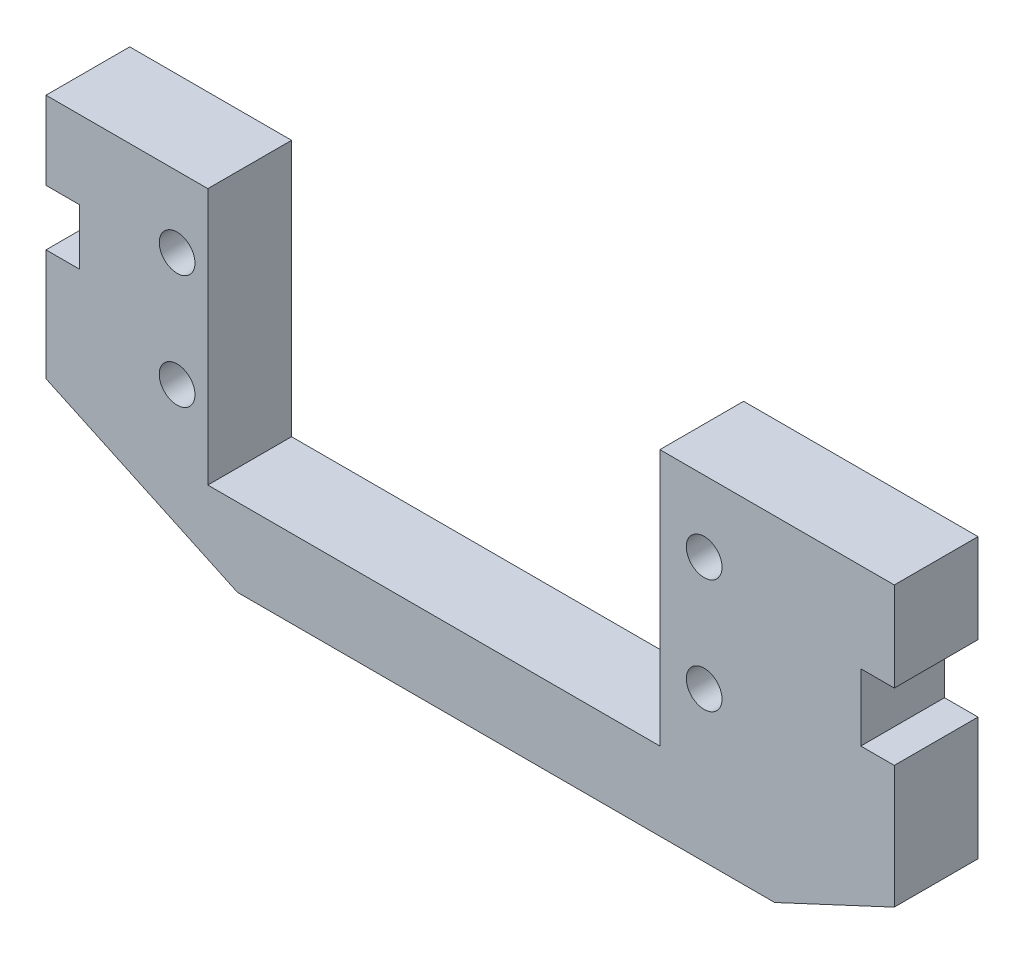
ISO-10303-21;
HEADER;
FILE_DESCRIPTION(('STEP AP214'),'2;1');
FILE_NAME('part.step','',(''),(''),'','','');
FILE_SCHEMA(('AUTOMOTIVE_DESIGN { 1 0 10303 214 1 1 1 1 }'));
ENDSEC;
DATA;
#1=APPLICATION_CONTEXT('core data for automotive mechanical design processes');
#2=APPLICATION_PROTOCOL_DEFINITION('international standard','automotive_design',2000,#1);
#3=PRODUCT_CONTEXT('',#1,'mechanical');
#4=PRODUCT('Part','Part','',(#3));
#5=PRODUCT_RELATED_PRODUCT_CATEGORY('part','',(#4));
#6=PRODUCT_DEFINITION_FORMATION('','',#4);
#7=PRODUCT_DEFINITION_CONTEXT('part definition',#1,'design');
#8=PRODUCT_DEFINITION('design','',#6,#7);
#9=PRODUCT_DEFINITION_SHAPE('','',#8);
#10=(LENGTH_UNIT() NAMED_UNIT(*) SI_UNIT(.MILLI.,.METRE.));
#11=(NAMED_UNIT(*) PLANE_ANGLE_UNIT() SI_UNIT($,.RADIAN.));
#12=(NAMED_UNIT(*) SI_UNIT($,.STERADIAN.) SOLID_ANGLE_UNIT());
#13=UNCERTAINTY_MEASURE_WITH_UNIT(LENGTH_MEASURE(1.E-05),#10,'distance_accuracy_value','');
#14=(GEOMETRIC_REPRESENTATION_CONTEXT(3) GLOBAL_UNCERTAINTY_ASSIGNED_CONTEXT((#13)) GLOBAL_UNIT_ASSIGNED_CONTEXT((#10,
#11,#12)) REPRESENTATION_CONTEXT('',''));
#15=CARTESIAN_POINT('',(0.,0.,0.));
#16=DIRECTION('',(0.,0.,1.));
#17=DIRECTION('',(1.,0.,0.));
#18=AXIS2_PLACEMENT_3D('',#15,#16,#17);
#19=CARTESIAN_POINT('',(0.,0.,7.5));
#20=DIRECTION('',(1.,0.,0.));
#21=DIRECTION('',(0.,1.,0.));
#22=AXIS2_PLACEMENT_3D('',#19,#20,#21);
#23=PLANE('',#22);
#24=DIRECTION('',(0.,-1.,0.));
#25=VECTOR('',#24,1.);
#26=CARTESIAN_POINT('',(0.,0.,0.));
#27=LINE('',#26,#25);
#28=CARTESIAN_POINT('',(0.,0.,0.));
#29=VERTEX_POINT('',#28);
#30=CARTESIAN_POINT('',(0.,-7.,0.));
#31=VERTEX_POINT('',#30);
#32=EDGE_CURVE('E180',#29,#31,#27,.T.);
#33=ORIENTED_EDGE('',*,*,#32,.T.);
#34=DIRECTION('',(0.,0.,1.));
#35=VECTOR('',#34,1.);
#36=CARTESIAN_POINT('',(0.,-7.,0.));
#37=LINE('',#36,#35);
#38=CARTESIAN_POINT('',(0.,-7.,7.5));
#39=VERTEX_POINT('',#38);
#40=EDGE_CURVE('E278',#31,#39,#37,.T.);
#41=ORIENTED_EDGE('',*,*,#40,.T.);
#42=DIRECTION('',(0.,-1.,0.));
#43=VECTOR('',#42,1.);
#44=CARTESIAN_POINT('',(0.,0.,7.5));
#45=LINE('',#44,#43);
#46=CARTESIAN_POINT('',(0.,0.,7.5));
#47=VERTEX_POINT('',#46);
#48=EDGE_CURVE('E253',#47,#39,#45,.T.);
#49=ORIENTED_EDGE('',*,*,#48,.F.);
#50=DIRECTION('',(0.,0.,-1.));
#51=VECTOR('',#50,1.);
#52=CARTESIAN_POINT('',(0.,0.,7.5));
#53=LINE('',#52,#51);
#54=EDGE_CURVE('E221',#47,#29,#53,.T.);
#55=ORIENTED_EDGE('',*,*,#54,.T.);
#56=EDGE_LOOP('',(#33,#41,#49,#55));
#57=FACE_BOUND('',#56,.T.);
#58=ADVANCED_FACE('F33',(#57),#23,.F.);
#59=CARTESIAN_POINT('',(76.,-30.,7.5));
#60=DIRECTION('',(-1.,0.,0.));
#61=DIRECTION('',(0.,0.,1.));
#62=AXIS2_PLACEMENT_3D('',#59,#60,#61);
#63=PLANE('',#62);
#64=DIRECTION('',(0.,1.,0.));
#65=VECTOR('',#64,1.);
#66=CARTESIAN_POINT('',(76.,-30.,0.));
#67=LINE('',#66,#65);
#68=CARTESIAN_POINT('',(76.,-25.,0.));
#69=VERTEX_POINT('',#68);
#70=CARTESIAN_POINT('',(76.,-14.,0.));
#71=VERTEX_POINT('',#70);
#72=EDGE_CURVE('E193',#69,#71,#67,.T.);
#73=ORIENTED_EDGE('',*,*,#72,.T.);
#74=DIRECTION('',(0.,0.,1.));
#75=VECTOR('',#74,1.);
#76=CARTESIAN_POINT('',(76.,-14.,0.));
#77=LINE('',#76,#75);
#78=CARTESIAN_POINT('',(76.,-14.,7.5));
#79=VERTEX_POINT('',#78);
#80=EDGE_CURVE('E283',#71,#79,#77,.T.);
#81=ORIENTED_EDGE('',*,*,#80,.T.);
#82=DIRECTION('',(0.,1.,0.));
#83=VECTOR('',#82,1.);
#84=CARTESIAN_POINT('',(76.,-30.,7.5));
#85=LINE('',#84,#83);
#86=CARTESIAN_POINT('',(76.,-25.,7.5));
#87=VERTEX_POINT('',#86);
#88=EDGE_CURVE('E260',#87,#79,#85,.T.);
#89=ORIENTED_EDGE('',*,*,#88,.F.);
#90=DIRECTION('',(0.,0.,-1.));
#91=VECTOR('',#90,1.);
#92=CARTESIAN_POINT('',(76.,-25.,7.5));
#93=LINE('',#92,#91);
#94=EDGE_CURVE('E232',#87,#69,#93,.T.);
#95=ORIENTED_EDGE('',*,*,#94,.T.);
#96=EDGE_LOOP('',(#73,#81,#89,#95));
#97=FACE_BOUND('',#96,.T.);
#98=ADVANCED_FACE('F258',(#97),#63,.F.);
#99=CARTESIAN_POINT('',(14.5,0.,7.5));
#100=DIRECTION('',(0.,-1.,0.));
#101=DIRECTION('',(1.,0.,0.));
#102=AXIS2_PLACEMENT_3D('',#99,#100,#101);
#103=PLANE('',#102);
#104=DIRECTION('',(-1.,0.,0.));
#105=VECTOR('',#104,1.);
#106=CARTESIAN_POINT('',(14.5,0.,0.));
#107=LINE('',#106,#105);
#108=CARTESIAN_POINT('',(14.5,0.,0.));
#109=VERTEX_POINT('',#108);
#110=EDGE_CURVE('E181',#109,#29,#107,.T.);
#111=ORIENTED_EDGE('',*,*,#110,.T.);
#112=ORIENTED_EDGE('',*,*,#54,.F.);
#113=DIRECTION('',(-1.,0.,0.));
#114=VECTOR('',#113,1.);
#115=CARTESIAN_POINT('',(14.5,0.,7.5));
#116=LINE('',#115,#114);
#117=CARTESIAN_POINT('',(14.5,0.,7.5));
#118=VERTEX_POINT('',#117);
#119=EDGE_CURVE('E204',#118,#47,#116,.T.);
#120=ORIENTED_EDGE('',*,*,#119,.F.);
#121=DIRECTION('',(0.,0.,-1.));
#122=VECTOR('',#121,1.);
#123=CARTESIAN_POINT('',(14.5,0.,7.5));
#124=LINE('',#123,#122);
#125=EDGE_CURVE('E205',#118,#109,#124,.T.);
#126=ORIENTED_EDGE('',*,*,#125,.T.);
#127=EDGE_LOOP('',(#111,#112,#120,#126));
#128=FACE_BOUND('',#127,.T.);
#129=ADVANCED_FACE('F332',(#128),#103,.F.);
#130=CARTESIAN_POINT('',(0.,-12.,7.5));
#131=VERTEX_POINT('',#130);
#132=CARTESIAN_POINT('',(0.,-22.,7.5));
#133=VERTEX_POINT('',#132);
#134=EDGE_CURVE('E173',#131,#133,#45,.T.);
#135=ORIENTED_EDGE('',*,*,#134,.F.);
#136=DIRECTION('',(0.,0.,1.));
#137=VECTOR('',#136,1.);
#138=CARTESIAN_POINT('',(0.,-12.,0.));
#139=LINE('',#138,#137);
#140=CARTESIAN_POINT('',(0.,-12.,0.));
#141=VERTEX_POINT('',#140);
#142=EDGE_CURVE('E160',#141,#131,#139,.T.);
#143=ORIENTED_EDGE('',*,*,#142,.F.);
#144=CARTESIAN_POINT('',(0.,-22.,0.));
#145=VERTEX_POINT('',#144);
#146=EDGE_CURVE('E171',#141,#145,#27,.T.);
#147=ORIENTED_EDGE('',*,*,#146,.T.);
#148=DIRECTION('',(0.,0.,1.));
#149=VECTOR('',#148,1.);
#150=CARTESIAN_POINT('',(0.,-22.,7.5));
#151=LINE('',#150,#149);
#152=EDGE_CURVE('E228',#145,#133,#151,.T.);
#153=ORIENTED_EDGE('',*,*,#152,.T.);
#154=EDGE_LOOP('',(#135,#143,#147,#153));
#155=FACE_BOUND('',#154,.T.);
#156=ADVANCED_FACE('F169',(#155),#23,.F.);
#157=CARTESIAN_POINT('',(0.,-30.,7.5));
#158=DIRECTION('',(0.,1.,0.));
#159=DIRECTION('',(0.,0.,1.));
#160=AXIS2_PLACEMENT_3D('',#157,#158,#159);
#161=PLANE('',#160);
#162=DIRECTION('',(1.,0.,0.));
#163=VECTOR('',#162,1.);
#164=CARTESIAN_POINT('',(0.,-30.,0.));
#165=LINE('',#164,#163);
#166=CARTESIAN_POINT('',(17.1560553640765,-30.,0.));
#167=VERTEX_POINT('',#166);
#168=CARTESIAN_POINT('',(65.2774653974522,-30.,0.));
#169=VERTEX_POINT('',#168);
#170=EDGE_CURVE('E184',#167,#169,#165,.T.);
#171=ORIENTED_EDGE('',*,*,#170,.T.);
#172=DIRECTION('',(0.,0.,1.));
#173=VECTOR('',#172,1.);
#174=CARTESIAN_POINT('',(65.2774653974522,-30.,7.5));
#175=LINE('',#174,#173);
#176=CARTESIAN_POINT('',(65.2774653974522,-30.,7.5));
#177=VERTEX_POINT('',#176);
#178=EDGE_CURVE('E41',#169,#177,#175,.T.);
#179=ORIENTED_EDGE('',*,*,#178,.T.);
#180=DIRECTION('',(1.,0.,0.));
#181=VECTOR('',#180,1.);
#182=CARTESIAN_POINT('',(0.,-30.,7.5));
#183=LINE('',#182,#181);
#184=CARTESIAN_POINT('',(17.1560553640765,-30.,7.5));
#185=VERTEX_POINT('',#184);
#186=EDGE_CURVE('E241',#185,#177,#183,.T.);
#187=ORIENTED_EDGE('',*,*,#186,.F.);
#188=DIRECTION('',(0.,0.,-1.));
#189=VECTOR('',#188,1.);
#190=CARTESIAN_POINT('',(17.1560553640765,-30.,7.5));
#191=LINE('',#190,#189);
#192=EDGE_CURVE('E224',#185,#167,#191,.T.);
#193=ORIENTED_EDGE('',*,*,#192,.T.);
#194=EDGE_LOOP('',(#171,#179,#187,#193));
#195=FACE_BOUND('',#194,.T.);
#196=ADVANCED_FACE('F240',(#195),#161,.F.);
#197=CARTESIAN_POINT('',(76.,-8.,7.5));
#198=VERTEX_POINT('',#197);
#199=CARTESIAN_POINT('',(76.,0.,7.5));
#200=VERTEX_POINT('',#199);
#201=EDGE_CURVE('E252',#198,#200,#85,.T.);
#202=ORIENTED_EDGE('',*,*,#201,.F.);
#203=DIRECTION('',(0.,0.,1.));
#204=VECTOR('',#203,1.);
#205=CARTESIAN_POINT('',(76.,-8.,0.));
#206=LINE('',#205,#204);
#207=CARTESIAN_POINT('',(76.,-8.,0.));
#208=VERTEX_POINT('',#207);
#209=EDGE_CURVE('E266',#208,#198,#206,.T.);
#210=ORIENTED_EDGE('',*,*,#209,.F.);
#211=CARTESIAN_POINT('',(76.,0.,0.));
#212=VERTEX_POINT('',#211);
#213=EDGE_CURVE('E192',#208,#212,#67,.T.);
#214=ORIENTED_EDGE('',*,*,#213,.T.);
#215=DIRECTION('',(0.,0.,-1.));
#216=VECTOR('',#215,1.);
#217=CARTESIAN_POINT('',(76.,0.,7.5));
#218=LINE('',#217,#216);
#219=EDGE_CURVE('E218',#200,#212,#218,.T.);
#220=ORIENTED_EDGE('',*,*,#219,.F.);
#221=EDGE_LOOP('',(#202,#210,#214,#220));
#222=FACE_BOUND('',#221,.T.);
#223=ADVANCED_FACE('F355',(#222),#63,.F.);
#224=CARTESIAN_POINT('',(76.,0.,7.5));
#225=DIRECTION('',(0.,-1.,0.));
#226=DIRECTION('',(1.,0.,0.));
#227=AXIS2_PLACEMENT_3D('',#224,#225,#226);
#228=PLANE('',#227);
#229=DIRECTION('',(-1.,0.,0.));
#230=VECTOR('',#229,1.);
#231=CARTESIAN_POINT('',(76.,0.,0.));
#232=LINE('',#231,#230);
#233=CARTESIAN_POINT('',(55.,0.,0.));
#234=VERTEX_POINT('',#233);
#235=EDGE_CURVE('E196',#212,#234,#232,.T.);
#236=ORIENTED_EDGE('',*,*,#235,.T.);
#237=DIRECTION('',(0.,0.,-1.));
#238=VECTOR('',#237,1.);
#239=CARTESIAN_POINT('',(55.,0.,7.5));
#240=LINE('',#239,#238);
#241=CARTESIAN_POINT('',(55.,0.,7.5));
#242=VERTEX_POINT('',#241);
#243=EDGE_CURVE('E215',#242,#234,#240,.T.);
#244=ORIENTED_EDGE('',*,*,#243,.F.);
#245=DIRECTION('',(-1.,0.,0.));
#246=VECTOR('',#245,1.);
#247=CARTESIAN_POINT('',(76.,0.,7.5));
#248=LINE('',#247,#246);
#249=EDGE_CURVE('E316',#200,#242,#248,.T.);
#250=ORIENTED_EDGE('',*,*,#249,.F.);
#251=ORIENTED_EDGE('',*,*,#219,.T.);
#252=EDGE_LOOP('',(#236,#244,#250,#251));
#253=FACE_BOUND('',#252,.T.);
#254=ADVANCED_FACE('F427',(#253),#228,.F.);
#255=CARTESIAN_POINT('',(55.,0.,7.5));
#256=DIRECTION('',(1.,0.,0.));
#257=DIRECTION('',(0.,1.,0.));
#258=AXIS2_PLACEMENT_3D('',#255,#256,#257);
#259=PLANE('',#258);
#260=DIRECTION('',(0.,-1.,0.));
#261=VECTOR('',#260,1.);
#262=CARTESIAN_POINT('',(55.,0.,0.));
#263=LINE('',#262,#261);
#264=CARTESIAN_POINT('',(55.,-23.,0.));
#265=VERTEX_POINT('',#264);
#266=EDGE_CURVE('E198',#234,#265,#263,.T.);
#267=ORIENTED_EDGE('',*,*,#266,.T.);
#268=DIRECTION('',(0.,0.,-1.));
#269=VECTOR('',#268,1.);
#270=CARTESIAN_POINT('',(55.,-23.,7.5));
#271=LINE('',#270,#269);
#272=CARTESIAN_POINT('',(55.,-23.,7.5));
#273=VERTEX_POINT('',#272);
#274=EDGE_CURVE('E212',#273,#265,#271,.T.);
#275=ORIENTED_EDGE('',*,*,#274,.F.);
#276=DIRECTION('',(0.,-1.,0.));
#277=VECTOR('',#276,1.);
#278=CARTESIAN_POINT('',(55.,0.,7.5));
#279=LINE('',#278,#277);
#280=EDGE_CURVE('E318',#242,#273,#279,.T.);
#281=ORIENTED_EDGE('',*,*,#280,.F.);
#282=ORIENTED_EDGE('',*,*,#243,.T.);
#283=EDGE_LOOP('',(#267,#275,#281,#282));
#284=FACE_BOUND('',#283,.T.);
#285=ADVANCED_FACE('F423',(#284),#259,.F.);
#286=CARTESIAN_POINT('',(55.,-23.,7.5));
#287=DIRECTION('',(0.,-1.,0.));
#288=DIRECTION('',(0.,0.,-1.));
#289=AXIS2_PLACEMENT_3D('',#286,#287,#288);
#290=PLANE('',#289);
#291=DIRECTION('',(-1.,0.,0.));
#292=VECTOR('',#291,1.);
#293=CARTESIAN_POINT('',(55.,-23.,0.));
#294=LINE('',#293,#292);
#295=CARTESIAN_POINT('',(14.5,-23.,0.));
#296=VERTEX_POINT('',#295);
#297=EDGE_CURVE('E200',#265,#296,#294,.T.);
#298=ORIENTED_EDGE('',*,*,#297,.T.);
#299=DIRECTION('',(0.,0.,-1.));
#300=VECTOR('',#299,1.);
#301=CARTESIAN_POINT('',(14.5,-23.,7.5));
#302=LINE('',#301,#300);
#303=CARTESIAN_POINT('',(14.5,-23.,7.5));
#304=VERTEX_POINT('',#303);
#305=EDGE_CURVE('E208',#304,#296,#302,.T.);
#306=ORIENTED_EDGE('',*,*,#305,.F.);
#307=DIRECTION('',(-1.,0.,0.));
#308=VECTOR('',#307,1.);
#309=CARTESIAN_POINT('',(55.,-23.,7.5));
#310=LINE('',#309,#308);
#311=EDGE_CURVE('E320',#273,#304,#310,.T.);
#312=ORIENTED_EDGE('',*,*,#311,.F.);
#313=ORIENTED_EDGE('',*,*,#274,.T.);
#314=EDGE_LOOP('',(#298,#306,#312,#313));
#315=FACE_BOUND('',#314,.T.);
#316=ADVANCED_FACE('F420',(#315),#290,.F.);
#317=CARTESIAN_POINT('',(14.5,-23.,7.5));
#318=DIRECTION('',(-1.,0.,0.));
#319=DIRECTION('',(0.,0.,1.));
#320=AXIS2_PLACEMENT_3D('',#317,#318,#319);
#321=PLANE('',#320);
#322=DIRECTION('',(0.,1.,0.));
#323=VECTOR('',#322,1.);
#324=CARTESIAN_POINT('',(14.5,-23.,0.));
#325=LINE('',#324,#323);
#326=EDGE_CURVE('E202',#296,#109,#325,.T.);
#327=ORIENTED_EDGE('',*,*,#326,.T.);
#328=ORIENTED_EDGE('',*,*,#125,.F.);
#329=DIRECTION('',(0.,1.,0.));
#330=VECTOR('',#329,1.);
#331=CARTESIAN_POINT('',(14.5,-23.,7.5));
#332=LINE('',#331,#330);
#333=EDGE_CURVE('E209',#304,#118,#332,.T.);
#334=ORIENTED_EDGE('',*,*,#333,.F.);
#335=ORIENTED_EDGE('',*,*,#305,.T.);
#336=EDGE_LOOP('',(#327,#328,#334,#335));
#337=FACE_BOUND('',#336,.T.);
#338=ADVANCED_FACE('F328',(#337),#321,.F.);
#339=CARTESIAN_POINT('',(0.,0.,7.5));
#340=DIRECTION('',(0.,0.,1.));
#341=DIRECTION('',(1.,0.,0.));
#342=AXIS2_PLACEMENT_3D('',#339,#340,#341);
#343=PLANE('',#342);
#344=DIRECTION('',(-1.,0.,0.));
#345=VECTOR('',#344,1.);
#346=CARTESIAN_POINT('',(0.,-7.,7.5));
#347=LINE('',#346,#345);
#348=CARTESIAN_POINT('',(3.,-7.,7.5));
#349=VERTEX_POINT('',#348);
#350=EDGE_CURVE('E165',#349,#39,#347,.T.);
#351=ORIENTED_EDGE('',*,*,#350,.F.);
#352=DIRECTION('',(0.,1.,0.));
#353=VECTOR('',#352,1.);
#354=CARTESIAN_POINT('',(3.,-7.,7.5));
#355=LINE('',#354,#353);
#356=CARTESIAN_POINT('',(3.,-12.,7.5));
#357=VERTEX_POINT('',#356);
#358=EDGE_CURVE('E337',#357,#349,#355,.T.);
#359=ORIENTED_EDGE('',*,*,#358,.F.);
#360=DIRECTION('',(1.,0.,0.));
#361=VECTOR('',#360,1.);
#362=CARTESIAN_POINT('',(0.,-12.,7.5));
#363=LINE('',#362,#361);
#364=EDGE_CURVE('E340',#131,#357,#363,.T.);
#365=ORIENTED_EDGE('',*,*,#364,.F.);
#366=ORIENTED_EDGE('',*,*,#134,.T.);
#367=DIRECTION('',(-0.906307787036649,0.422618261740701,0.));
#368=VECTOR('',#367,1.);
#369=CARTESIAN_POINT('',(-8.42648887430877,-18.0706637065519,7.5));
#370=LINE('',#369,#368);
#371=EDGE_CURVE('E230',#133,#185,#370,.F.);
#372=ORIENTED_EDGE('',*,*,#371,.T.);
#373=ORIENTED_EDGE('',*,*,#186,.T.);
#374=DIRECTION('',(-0.90630778703665,-0.4226182617407,0.));
#375=VECTOR('',#374,1.);
#376=CARTESIAN_POINT('',(23.1496263708988,-49.6445339596029,7.5));
#377=LINE('',#376,#375);
#378=EDGE_CURVE('E11',#177,#87,#377,.F.);
#379=ORIENTED_EDGE('',*,*,#378,.T.);
#380=ORIENTED_EDGE('',*,*,#88,.T.);
#381=DIRECTION('',(1.,0.,0.));
#382=VECTOR('',#381,1.);
#383=CARTESIAN_POINT('',(76.,-14.,7.5));
#384=LINE('',#383,#382);
#385=CARTESIAN_POINT('',(73.,-14.,7.5));
#386=VERTEX_POINT('',#385);
#387=EDGE_CURVE('E281',#386,#79,#384,.T.);
#388=ORIENTED_EDGE('',*,*,#387,.F.);
#389=DIRECTION('',(0.,-1.,0.));
#390=VECTOR('',#389,1.);
#391=CARTESIAN_POINT('',(73.,-8.,7.5));
#392=LINE('',#391,#390);
#393=CARTESIAN_POINT('',(73.,-8.,7.5));
#394=VERTEX_POINT('',#393);
#395=EDGE_CURVE('E277',#394,#386,#392,.T.);
#396=ORIENTED_EDGE('',*,*,#395,.F.);
#397=DIRECTION('',(-1.,0.,0.));
#398=VECTOR('',#397,1.);
#399=CARTESIAN_POINT('',(76.,-8.,7.5));
#400=LINE('',#399,#398);
#401=EDGE_CURVE('E274',#198,#394,#400,.T.);
#402=ORIENTED_EDGE('',*,*,#401,.F.);
#403=ORIENTED_EDGE('',*,*,#201,.T.);
#404=ORIENTED_EDGE('',*,*,#249,.T.);
#405=ORIENTED_EDGE('',*,*,#280,.T.);
#406=ORIENTED_EDGE('',*,*,#311,.T.);
#407=ORIENTED_EDGE('',*,*,#333,.T.);
#408=ORIENTED_EDGE('',*,*,#119,.T.);
#409=ORIENTED_EDGE('',*,*,#48,.T.);
#410=EDGE_LOOP('',(#351,#359,#365,#366,#372,#373,#379,#380,#388,#396,#402,#403,#404,#405,#406,
#407,#408,#409));
#411=FACE_BOUND('',#410,.T.);
#412=CARTESIAN_POINT('',(11.7465585584013,-6.34877882170332,7.5));
#413=DIRECTION('',(0.,0.,-1.));
#414=DIRECTION('',(-1.,0.,0.));
#415=AXIS2_PLACEMENT_3D('',#412,#413,#414);
#416=CIRCLE('',#415,1.6);
#417=CARTESIAN_POINT('',(10.1465585584013,-6.34877882170332,7.5));
#418=VERTEX_POINT('',#417);
#419=EDGE_CURVE('E289',#418,#418,#416,.T.);
#420=ORIENTED_EDGE('',*,*,#419,.T.);
#421=EDGE_LOOP('',(#420));
#422=FACE_BOUND('',#421,.T.);
#423=CARTESIAN_POINT('',(58.9660548946277,-16.5763261783068,7.5));
#424=DIRECTION('',(0.,0.,-1.));
#425=DIRECTION('',(-1.,0.,0.));
#426=AXIS2_PLACEMENT_3D('',#423,#424,#425);
#427=CIRCLE('',#426,1.6);
#428=CARTESIAN_POINT('',(57.3660548946277,-16.5763261783068,7.5));
#429=VERTEX_POINT('',#428);
#430=EDGE_CURVE('E296',#429,#429,#427,.T.);
#431=ORIENTED_EDGE('',*,*,#430,.T.);
#432=EDGE_LOOP('',(#431));
#433=FACE_BOUND('',#432,.T.);
#434=CARTESIAN_POINT('',(58.9660548946277,-6.34877882170332,7.5));
#435=DIRECTION('',(0.,0.,-1.));
#436=DIRECTION('',(-1.,0.,0.));
#437=AXIS2_PLACEMENT_3D('',#434,#435,#436);
#438=CIRCLE('',#437,1.6);
#439=CARTESIAN_POINT('',(57.3660548946277,-6.34877882170332,7.5));
#440=VERTEX_POINT('',#439);
#441=EDGE_CURVE('E302',#440,#440,#438,.T.);
#442=ORIENTED_EDGE('',*,*,#441,.T.);
#443=EDGE_LOOP('',(#442));
#444=FACE_BOUND('',#443,.T.);
#445=CARTESIAN_POINT('',(11.7465585584013,-16.5763261783068,7.5));
#446=DIRECTION('',(0.,0.,-1.));
#447=DIRECTION('',(-1.,0.,0.));
#448=AXIS2_PLACEMENT_3D('',#445,#446,#447);
#449=CIRCLE('',#448,1.6);
#450=CARTESIAN_POINT('',(10.1465585584013,-16.5763261783068,7.5));
#451=VERTEX_POINT('',#450);
#452=EDGE_CURVE('E186',#451,#451,#449,.T.);
#453=ORIENTED_EDGE('',*,*,#452,.T.);
#454=EDGE_LOOP('',(#453));
#455=FACE_BOUND('',#454,.T.);
#456=ADVANCED_FACE('F247',(#411,#422,#433,#444,#455),#343,.T.);
#457=CARTESIAN_POINT('',(0.,0.,0.));
#458=DIRECTION('',(0.,0.,1.));
#459=DIRECTION('',(1.,0.,0.));
#460=AXIS2_PLACEMENT_3D('',#457,#458,#459);
#461=PLANE('',#460);
#462=CARTESIAN_POINT('',(11.7465585584013,-6.34877882170332,0.));
#463=DIRECTION('',(0.,0.,-1.));
#464=DIRECTION('',(-1.,0.,0.));
#465=AXIS2_PLACEMENT_3D('',#462,#463,#464);
#466=CIRCLE('',#465,1.6);
#467=CARTESIAN_POINT('',(10.1465585584013,-6.34877882170332,0.));
#468=VERTEX_POINT('',#467);
#469=EDGE_CURVE('E293',#468,#468,#466,.T.);
#470=ORIENTED_EDGE('',*,*,#469,.F.);
#471=EDGE_LOOP('',(#470));
#472=FACE_BOUND('',#471,.T.);
#473=CARTESIAN_POINT('',(58.9660548946277,-16.5763261783068,0.));
#474=DIRECTION('',(0.,0.,-1.));
#475=DIRECTION('',(-1.,0.,0.));
#476=AXIS2_PLACEMENT_3D('',#473,#474,#475);
#477=CIRCLE('',#476,1.6);
#478=CARTESIAN_POINT('',(57.3660548946277,-16.5763261783068,0.));
#479=VERTEX_POINT('',#478);
#480=EDGE_CURVE('E299',#479,#479,#477,.T.);
#481=ORIENTED_EDGE('',*,*,#480,.F.);
#482=EDGE_LOOP('',(#481));
#483=FACE_BOUND('',#482,.T.);
#484=CARTESIAN_POINT('',(58.9660548946277,-6.34877882170332,0.));
#485=DIRECTION('',(0.,0.,-1.));
#486=DIRECTION('',(-1.,0.,0.));
#487=AXIS2_PLACEMENT_3D('',#484,#485,#486);
#488=CIRCLE('',#487,1.6);
#489=CARTESIAN_POINT('',(57.3660548946277,-6.34877882170332,0.));
#490=VERTEX_POINT('',#489);
#491=EDGE_CURVE('E285',#490,#490,#488,.T.);
#492=ORIENTED_EDGE('',*,*,#491,.F.);
#493=EDGE_LOOP('',(#492));
#494=FACE_BOUND('',#493,.T.);
#495=CARTESIAN_POINT('',(11.7465585584013,-16.5763261783068,0.));
#496=DIRECTION('',(0.,0.,-1.));
#497=DIRECTION('',(-1.,0.,0.));
#498=AXIS2_PLACEMENT_3D('',#495,#496,#497);
#499=CIRCLE('',#498,1.6);
#500=CARTESIAN_POINT('',(10.1465585584013,-16.5763261783068,0.));
#501=VERTEX_POINT('',#500);
#502=EDGE_CURVE('E292',#501,#501,#499,.T.);
#503=ORIENTED_EDGE('',*,*,#502,.F.);
#504=EDGE_LOOP('',(#503));
#505=FACE_BOUND('',#504,.T.);
#506=DIRECTION('',(0.,1.,0.));
#507=VECTOR('',#506,1.);
#508=CARTESIAN_POINT('',(3.,-7.,0.));
#509=LINE('',#508,#507);
#510=CARTESIAN_POINT('',(3.,-12.,0.));
#511=VERTEX_POINT('',#510);
#512=CARTESIAN_POINT('',(3.,-7.,0.));
#513=VERTEX_POINT('',#512);
#514=EDGE_CURVE('E48',#511,#513,#509,.T.);
#515=ORIENTED_EDGE('',*,*,#514,.T.);
#516=DIRECTION('',(-1.,0.,0.));
#517=VECTOR('',#516,1.);
#518=CARTESIAN_POINT('',(0.,-7.,0.));
#519=LINE('',#518,#517);
#520=EDGE_CURVE('E174',#513,#31,#519,.T.);
#521=ORIENTED_EDGE('',*,*,#520,.T.);
#522=ORIENTED_EDGE('',*,*,#32,.F.);
#523=ORIENTED_EDGE('',*,*,#110,.F.);
#524=ORIENTED_EDGE('',*,*,#326,.F.);
#525=ORIENTED_EDGE('',*,*,#297,.F.);
#526=ORIENTED_EDGE('',*,*,#266,.F.);
#527=ORIENTED_EDGE('',*,*,#235,.F.);
#528=ORIENTED_EDGE('',*,*,#213,.F.);
#529=DIRECTION('',(-1.,0.,0.));
#530=VECTOR('',#529,1.);
#531=CARTESIAN_POINT('',(76.,-8.,0.));
#532=LINE('',#531,#530);
#533=CARTESIAN_POINT('',(73.,-8.,0.));
#534=VERTEX_POINT('',#533);
#535=EDGE_CURVE('E270',#208,#534,#532,.T.);
#536=ORIENTED_EDGE('',*,*,#535,.T.);
#537=DIRECTION('',(0.,-1.,0.));
#538=VECTOR('',#537,1.);
#539=CARTESIAN_POINT('',(73.,-8.,0.));
#540=LINE('',#539,#538);
#541=CARTESIAN_POINT('',(73.,-14.,0.));
#542=VERTEX_POINT('',#541);
#543=EDGE_CURVE('E56',#534,#542,#540,.T.);
#544=ORIENTED_EDGE('',*,*,#543,.T.);
#545=DIRECTION('',(1.,0.,0.));
#546=VECTOR('',#545,1.);
#547=CARTESIAN_POINT('',(76.,-14.,0.));
#548=LINE('',#547,#546);
#549=EDGE_CURVE('E263',#542,#71,#548,.T.);
#550=ORIENTED_EDGE('',*,*,#549,.T.);
#551=ORIENTED_EDGE('',*,*,#72,.F.);
#552=DIRECTION('',(0.90630778703665,0.4226182617407,0.));
#553=VECTOR('',#552,1.);
#554=CARTESIAN_POINT('',(76.,-25.,0.));
#555=LINE('',#554,#553);
#556=EDGE_CURVE('E235',#69,#169,#555,.F.);
#557=ORIENTED_EDGE('',*,*,#556,.T.);
#558=ORIENTED_EDGE('',*,*,#170,.F.);
#559=DIRECTION('',(0.906307787036649,-0.422618261740701,0.));
#560=VECTOR('',#559,1.);
#561=CARTESIAN_POINT('',(17.1560553640765,-30.,0.));
#562=LINE('',#561,#560);
#563=EDGE_CURVE('E178',#167,#145,#562,.F.);
#564=ORIENTED_EDGE('',*,*,#563,.T.);
#565=ORIENTED_EDGE('',*,*,#146,.F.);
#566=DIRECTION('',(1.,0.,0.));
#567=VECTOR('',#566,1.);
#568=CARTESIAN_POINT('',(0.,-12.,0.));
#569=LINE('',#568,#567);
#570=EDGE_CURVE('E156',#141,#511,#569,.T.);
#571=ORIENTED_EDGE('',*,*,#570,.T.);
#572=EDGE_LOOP('',(#515,#521,#522,#523,#524,#525,#526,#527,#528,#536,#544,#550,#551,#557,#558,
#564,#565,#571));
#573=FACE_BOUND('',#572,.T.);
#574=ADVANCED_FACE('F176',(#472,#483,#494,#505,#573),#461,.F.);
#575=CARTESIAN_POINT('',(11.7465585584013,-16.5763261783068,7.5));
#576=DIRECTION('',(0.,0.,-1.));
#577=DIRECTION('',(-1.,0.,0.));
#578=AXIS2_PLACEMENT_3D('',#575,#576,#577);
#579=CYLINDRICAL_SURFACE('',#578,1.6);
#580=ORIENTED_EDGE('',*,*,#452,.F.);
#581=EDGE_LOOP('',(#580));
#582=FACE_BOUND('',#581,.T.);
#583=ORIENTED_EDGE('',*,*,#502,.T.);
#584=EDGE_LOOP('',(#583));
#585=FACE_BOUND('',#584,.T.);
#586=ADVANCED_FACE('F408',(#582,#585),#579,.F.);
#587=CARTESIAN_POINT('',(58.9660548946277,-6.34877882170332,7.5));
#588=DIRECTION('',(0.,0.,-1.));
#589=DIRECTION('',(-1.,0.,0.));
#590=AXIS2_PLACEMENT_3D('',#587,#588,#589);
#591=CYLINDRICAL_SURFACE('',#590,1.6);
#592=ORIENTED_EDGE('',*,*,#441,.F.);
#593=EDGE_LOOP('',(#592));
#594=FACE_BOUND('',#593,.T.);
#595=ORIENTED_EDGE('',*,*,#491,.T.);
#596=EDGE_LOOP('',(#595));
#597=FACE_BOUND('',#596,.T.);
#598=ADVANCED_FACE('F399',(#594,#597),#591,.F.);
#599=CARTESIAN_POINT('',(58.9660548946277,-16.5763261783068,7.5));
#600=DIRECTION('',(0.,0.,-1.));
#601=DIRECTION('',(-1.,0.,0.));
#602=AXIS2_PLACEMENT_3D('',#599,#600,#601);
#603=CYLINDRICAL_SURFACE('',#602,1.6);
#604=ORIENTED_EDGE('',*,*,#430,.F.);
#605=EDGE_LOOP('',(#604));
#606=FACE_BOUND('',#605,.T.);
#607=ORIENTED_EDGE('',*,*,#480,.T.);
#608=EDGE_LOOP('',(#607));
#609=FACE_BOUND('',#608,.T.);
#610=ADVANCED_FACE('F393',(#606,#609),#603,.F.);
#611=CARTESIAN_POINT('',(11.7465585584013,-6.34877882170332,7.5));
#612=DIRECTION('',(0.,0.,-1.));
#613=DIRECTION('',(-1.,0.,0.));
#614=AXIS2_PLACEMENT_3D('',#611,#612,#613);
#615=CYLINDRICAL_SURFACE('',#614,1.6);
#616=ORIENTED_EDGE('',*,*,#419,.F.);
#617=EDGE_LOOP('',(#616));
#618=FACE_BOUND('',#617,.T.);
#619=ORIENTED_EDGE('',*,*,#469,.T.);
#620=EDGE_LOOP('',(#619));
#621=FACE_BOUND('',#620,.T.);
#622=ADVANCED_FACE('F388',(#618,#621),#615,.F.);
#623=CARTESIAN_POINT('',(17.1560553640765,-30.,7.5));
#624=DIRECTION('',(0.422618261740701,0.906307787036649,0.));
#625=DIRECTION('',(0.,0.,-1.));
#626=AXIS2_PLACEMENT_3D('',#623,#624,#625);
#627=PLANE('',#626);
#628=ORIENTED_EDGE('',*,*,#371,.F.);
#629=ORIENTED_EDGE('',*,*,#152,.F.);
#630=ORIENTED_EDGE('',*,*,#563,.F.);
#631=ORIENTED_EDGE('',*,*,#192,.F.);
#632=EDGE_LOOP('',(#628,#629,#630,#631));
#633=FACE_BOUND('',#632,.T.);
#634=ADVANCED_FACE('F370',(#633),#627,.F.);
#635=CARTESIAN_POINT('',(76.,-25.,7.5));
#636=DIRECTION('',(-0.4226182617407,0.90630778703665,0.));
#637=DIRECTION('',(0.,0.,-1.));
#638=AXIS2_PLACEMENT_3D('',#635,#636,#637);
#639=PLANE('',#638);
#640=ORIENTED_EDGE('',*,*,#378,.F.);
#641=ORIENTED_EDGE('',*,*,#178,.F.);
#642=ORIENTED_EDGE('',*,*,#556,.F.);
#643=ORIENTED_EDGE('',*,*,#94,.F.);
#644=EDGE_LOOP('',(#640,#641,#642,#643));
#645=FACE_BOUND('',#644,.T.);
#646=ADVANCED_FACE('F35',(#645),#639,.F.);
#647=CARTESIAN_POINT('',(76.,-14.,0.));
#648=DIRECTION('',(0.,-1.,0.));
#649=DIRECTION('',(1.,0.,0.));
#650=AXIS2_PLACEMENT_3D('',#647,#648,#649);
#651=PLANE('',#650);
#652=ORIENTED_EDGE('',*,*,#387,.T.);
#653=ORIENTED_EDGE('',*,*,#80,.F.);
#654=ORIENTED_EDGE('',*,*,#549,.F.);
#655=DIRECTION('',(0.,0.,1.));
#656=VECTOR('',#655,1.);
#657=CARTESIAN_POINT('',(73.,-14.,0.));
#658=LINE('',#657,#656);
#659=EDGE_CURVE('E286',#542,#386,#658,.T.);
#660=ORIENTED_EDGE('',*,*,#659,.T.);
#661=EDGE_LOOP('',(#652,#653,#654,#660));
#662=FACE_BOUND('',#661,.T.);
#663=ADVANCED_FACE('F362',(#662),#651,.F.);
#664=CARTESIAN_POINT('',(73.,-8.,0.));
#665=DIRECTION('',(-1.,0.,0.));
#666=DIRECTION('',(0.,0.,1.));
#667=AXIS2_PLACEMENT_3D('',#664,#665,#666);
#668=PLANE('',#667);
#669=ORIENTED_EDGE('',*,*,#395,.T.);
#670=ORIENTED_EDGE('',*,*,#659,.F.);
#671=ORIENTED_EDGE('',*,*,#543,.F.);
#672=DIRECTION('',(0.,0.,1.));
#673=VECTOR('',#672,1.);
#674=CARTESIAN_POINT('',(73.,-8.,0.));
#675=LINE('',#674,#673);
#676=EDGE_CURVE('E268',#534,#394,#675,.T.);
#677=ORIENTED_EDGE('',*,*,#676,.T.);
#678=EDGE_LOOP('',(#669,#670,#671,#677));
#679=FACE_BOUND('',#678,.T.);
#680=ADVANCED_FACE('F361',(#679),#668,.F.);
#681=CARTESIAN_POINT('',(76.,-8.,0.));
#682=DIRECTION('',(0.,1.,0.));
#683=DIRECTION('',(0.,0.,1.));
#684=AXIS2_PLACEMENT_3D('',#681,#682,#683);
#685=PLANE('',#684);
#686=ORIENTED_EDGE('',*,*,#401,.T.);
#687=ORIENTED_EDGE('',*,*,#676,.F.);
#688=ORIENTED_EDGE('',*,*,#535,.F.);
#689=ORIENTED_EDGE('',*,*,#209,.T.);
#690=EDGE_LOOP('',(#686,#687,#688,#689));
#691=FACE_BOUND('',#690,.T.);
#692=ADVANCED_FACE('F351',(#691),#685,.F.);
#693=CARTESIAN_POINT('',(0.,-7.,0.));
#694=DIRECTION('',(0.,1.,0.));
#695=DIRECTION('',(-1.,0.,0.));
#696=AXIS2_PLACEMENT_3D('',#693,#694,#695);
#697=PLANE('',#696);
#698=ORIENTED_EDGE('',*,*,#350,.T.);
#699=ORIENTED_EDGE('',*,*,#40,.F.);
#700=ORIENTED_EDGE('',*,*,#520,.F.);
#701=DIRECTION('',(0.,0.,1.));
#702=VECTOR('',#701,1.);
#703=CARTESIAN_POINT('',(3.,-7.,0.));
#704=LINE('',#703,#702);
#705=EDGE_CURVE('E345',#513,#349,#704,.T.);
#706=ORIENTED_EDGE('',*,*,#705,.T.);
#707=EDGE_LOOP('',(#698,#699,#700,#706));
#708=FACE_BOUND('',#707,.T.);
#709=ADVANCED_FACE('F527',(#708),#697,.F.);
#710=CARTESIAN_POINT('',(3.,-7.,0.));
#711=DIRECTION('',(1.,0.,0.));
#712=DIRECTION('',(0.,1.,0.));
#713=AXIS2_PLACEMENT_3D('',#710,#711,#712);
#714=PLANE('',#713);
#715=ORIENTED_EDGE('',*,*,#358,.T.);
#716=ORIENTED_EDGE('',*,*,#705,.F.);
#717=ORIENTED_EDGE('',*,*,#514,.F.);
#718=DIRECTION('',(0.,0.,1.));
#719=VECTOR('',#718,1.);
#720=CARTESIAN_POINT('',(3.,-12.,0.));
#721=LINE('',#720,#719);
#722=EDGE_CURVE('E162',#511,#357,#721,.T.);
#723=ORIENTED_EDGE('',*,*,#722,.T.);
#724=EDGE_LOOP('',(#715,#716,#717,#723));
#725=FACE_BOUND('',#724,.T.);
#726=ADVANCED_FACE('F534',(#725),#714,.F.);
#727=CARTESIAN_POINT('',(0.,-12.,0.));
#728=DIRECTION('',(0.,-1.,0.));
#729=DIRECTION('',(0.,0.,-1.));
#730=AXIS2_PLACEMENT_3D('',#727,#728,#729);
#731=PLANE('',#730);
#732=ORIENTED_EDGE('',*,*,#364,.T.);
#733=ORIENTED_EDGE('',*,*,#722,.F.);
#734=ORIENTED_EDGE('',*,*,#570,.F.);
#735=ORIENTED_EDGE('',*,*,#142,.T.);
#736=EDGE_LOOP('',(#732,#733,#734,#735));
#737=FACE_BOUND('',#736,.T.);
#738=ADVANCED_FACE('F159',(#737),#731,.F.);
#739=CLOSED_SHELL('',(#58,#98,#129,#156,#196,#223,#254,#285,#316,#338,#456,#574,#586,#598,#610,
#622,#634,#646,#663,#680,#692,#709,#726,#738));
#740=MANIFOLD_SOLID_BREP('B2',#739);
#741=ADVANCED_BREP_SHAPE_REPRESENTATION('',(#18,#740),#14);
#742=SHAPE_DEFINITION_REPRESENTATION(#9,#741);
ENDSEC;
END-ISO-10303-21;
